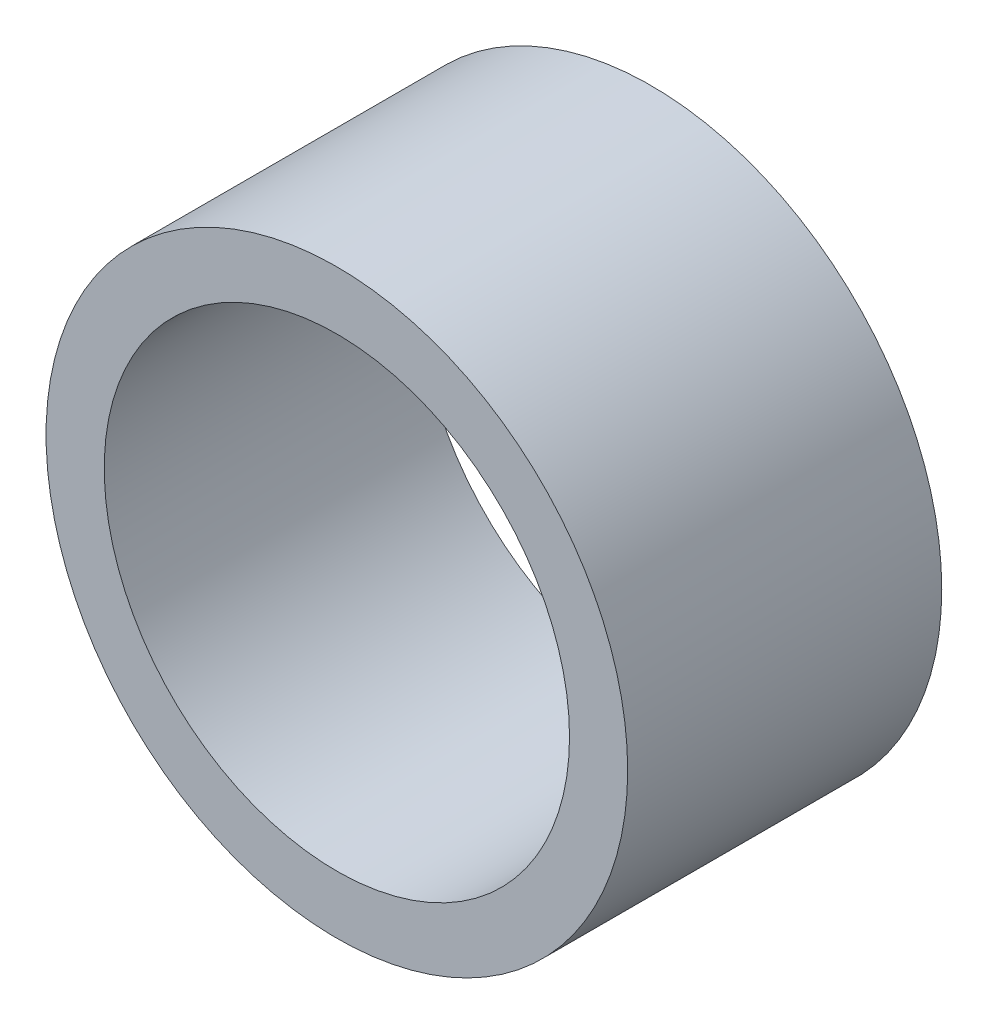
ISO-10303-21;
HEADER;
FILE_DESCRIPTION(('STEP AP214'),'2;1');
FILE_NAME('part.step','',(''),(''),'','','');
FILE_SCHEMA(('AUTOMOTIVE_DESIGN { 1 0 10303 214 1 1 1 1 }'));
ENDSEC;
DATA;
#1=APPLICATION_CONTEXT('core data for automotive mechanical design processes');
#2=APPLICATION_PROTOCOL_DEFINITION('international standard','automotive_design',2000,#1);
#3=PRODUCT_CONTEXT('',#1,'mechanical');
#4=PRODUCT('Part','Part','',(#3));
#5=PRODUCT_RELATED_PRODUCT_CATEGORY('part','',(#4));
#6=PRODUCT_DEFINITION_FORMATION('','',#4);
#7=PRODUCT_DEFINITION_CONTEXT('part definition',#1,'design');
#8=PRODUCT_DEFINITION('design','',#6,#7);
#9=PRODUCT_DEFINITION_SHAPE('','',#8);
#10=(LENGTH_UNIT() NAMED_UNIT(*) SI_UNIT(.MILLI.,.METRE.));
#11=(NAMED_UNIT(*) PLANE_ANGLE_UNIT() SI_UNIT($,.RADIAN.));
#12=(NAMED_UNIT(*) SI_UNIT($,.STERADIAN.) SOLID_ANGLE_UNIT());
#13=UNCERTAINTY_MEASURE_WITH_UNIT(LENGTH_MEASURE(1.E-05),#10,'distance_accuracy_value','');
#14=(GEOMETRIC_REPRESENTATION_CONTEXT(3) GLOBAL_UNCERTAINTY_ASSIGNED_CONTEXT((#13)) GLOBAL_UNIT_ASSIGNED_CONTEXT((#10,
#11,#12)) REPRESENTATION_CONTEXT('',''));
#15=CARTESIAN_POINT('',(0.,0.,0.));
#16=DIRECTION('',(0.,0.,1.));
#17=DIRECTION('',(1.,0.,0.));
#18=AXIS2_PLACEMENT_3D('',#15,#16,#17);
#19=CARTESIAN_POINT('',(0.,2.,0.));
#20=DIRECTION('',(0.,0.,-1.));
#21=DIRECTION('',(-1.,0.,0.));
#22=AXIS2_PLACEMENT_3D('',#19,#20,#21);
#23=PLANE('',#22);
#24=CARTESIAN_POINT('',(0.,0.,0.));
#25=DIRECTION('',(0.,0.,1.));
#26=DIRECTION('',(1.,0.,0.));
#27=AXIS2_PLACEMENT_3D('',#24,#25,#26);
#28=CIRCLE('',#27,2.);
#29=CARTESIAN_POINT('',(2.,0.,0.));
#30=VERTEX_POINT('',#29);
#31=EDGE_CURVE('E43',#30,#30,#28,.T.);
#32=ORIENTED_EDGE('',*,*,#31,.F.);
#33=EDGE_LOOP('',(#32));
#34=FACE_BOUND('',#33,.T.);
#35=CARTESIAN_POINT('',(0.,0.,0.));
#36=DIRECTION('',(0.,0.,1.));
#37=DIRECTION('',(1.,0.,0.));
#38=AXIS2_PLACEMENT_3D('',#35,#36,#37);
#39=CIRCLE('',#38,2.5);
#40=CARTESIAN_POINT('',(2.5,0.,0.));
#41=VERTEX_POINT('',#40);
#42=EDGE_CURVE('E10',#41,#41,#39,.T.);
#43=ORIENTED_EDGE('',*,*,#42,.T.);
#44=EDGE_LOOP('',(#43));
#45=FACE_BOUND('',#44,.T.);
#46=ADVANCED_FACE('F33',(#34,#45),#23,.F.);
#47=CARTESIAN_POINT('',(0.,0.,20.7004155612658));
#48=DIRECTION('',(0.,0.,1.));
#49=DIRECTION('',(1.,0.,0.));
#50=AXIS2_PLACEMENT_3D('',#47,#48,#49);
#51=CYLINDRICAL_SURFACE('',#50,2.5);
#52=ORIENTED_EDGE('',*,*,#42,.F.);
#53=EDGE_LOOP('',(#52));
#54=FACE_BOUND('',#53,.T.);
#55=CARTESIAN_POINT('',(0.,0.,-2.7));
#56=DIRECTION('',(0.,0.,1.));
#57=DIRECTION('',(1.,0.,0.));
#58=AXIS2_PLACEMENT_3D('',#55,#56,#57);
#59=CIRCLE('',#58,2.5);
#60=CARTESIAN_POINT('',(2.5,0.,-2.7));
#61=VERTEX_POINT('',#60);
#62=EDGE_CURVE('E39',#61,#61,#59,.T.);
#63=ORIENTED_EDGE('',*,*,#62,.T.);
#64=EDGE_LOOP('',(#63));
#65=FACE_BOUND('',#64,.T.);
#66=ADVANCED_FACE('F63',(#54,#65),#51,.T.);
#67=CARTESIAN_POINT('',(0.,2.5,-2.7));
#68=DIRECTION('',(0.,0.,1.));
#69=DIRECTION('',(1.,0.,0.));
#70=AXIS2_PLACEMENT_3D('',#67,#68,#69);
#71=PLANE('',#70);
#72=CARTESIAN_POINT('',(0.,0.,-2.7));
#73=DIRECTION('',(0.,0.,1.));
#74=DIRECTION('',(1.,0.,0.));
#75=AXIS2_PLACEMENT_3D('',#72,#73,#74);
#76=CIRCLE('',#75,2.);
#77=CARTESIAN_POINT('',(2.,0.,-2.7));
#78=VERTEX_POINT('',#77);
#79=EDGE_CURVE('E47',#78,#78,#76,.T.);
#80=ORIENTED_EDGE('',*,*,#79,.T.);
#81=EDGE_LOOP('',(#80));
#82=FACE_BOUND('',#81,.T.);
#83=ORIENTED_EDGE('',*,*,#62,.F.);
#84=EDGE_LOOP('',(#83));
#85=FACE_BOUND('',#84,.T.);
#86=ADVANCED_FACE('F53',(#82,#85),#71,.F.);
#87=CARTESIAN_POINT('',(0.,0.,20.7004155612658));
#88=DIRECTION('',(0.,0.,1.));
#89=DIRECTION('',(1.,0.,0.));
#90=AXIS2_PLACEMENT_3D('',#87,#88,#89);
#91=CYLINDRICAL_SURFACE('',#90,2.);
#92=ORIENTED_EDGE('',*,*,#31,.T.);
#93=EDGE_LOOP('',(#92));
#94=FACE_BOUND('',#93,.T.);
#95=ORIENTED_EDGE('',*,*,#79,.F.);
#96=EDGE_LOOP('',(#95));
#97=FACE_BOUND('',#96,.T.);
#98=ADVANCED_FACE('F56',(#94,#97),#91,.F.);
#99=CLOSED_SHELL('',(#46,#66,#86,#98));
#100=MANIFOLD_SOLID_BREP('B2',#99);
#101=ADVANCED_BREP_SHAPE_REPRESENTATION('',(#18,#100),#14);
#102=SHAPE_DEFINITION_REPRESENTATION(#9,#101);
ENDSEC;
END-ISO-10303-21;
